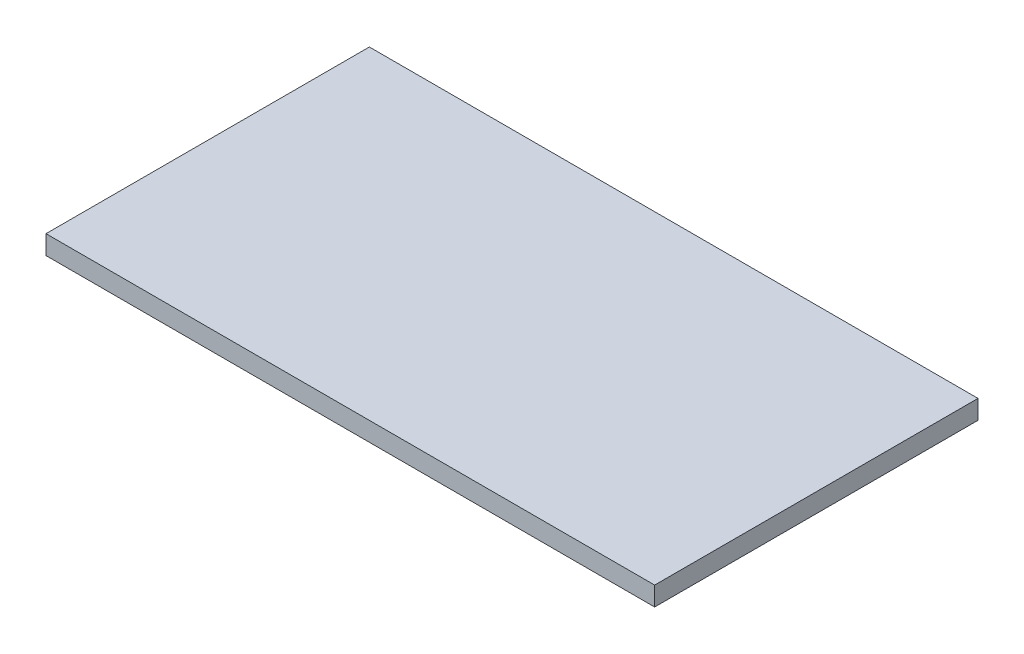
ISO-10303-21;
HEADER;
FILE_DESCRIPTION(('STEP AP214'),'2;1');
FILE_NAME('part.step','',(''),(''),'','','');
FILE_SCHEMA(('AUTOMOTIVE_DESIGN { 1 0 10303 214 1 1 1 1 }'));
ENDSEC;
DATA;
#1=APPLICATION_CONTEXT('core data for automotive mechanical design processes');
#2=APPLICATION_PROTOCOL_DEFINITION('international standard','automotive_design',2000,#1);
#3=PRODUCT_CONTEXT('',#1,'mechanical');
#4=PRODUCT('Part','Part','',(#3));
#5=PRODUCT_RELATED_PRODUCT_CATEGORY('part','',(#4));
#6=PRODUCT_DEFINITION_FORMATION('','',#4);
#7=PRODUCT_DEFINITION_CONTEXT('part definition',#1,'design');
#8=PRODUCT_DEFINITION('design','',#6,#7);
#9=PRODUCT_DEFINITION_SHAPE('','',#8);
#10=(LENGTH_UNIT() NAMED_UNIT(*) SI_UNIT(.MILLI.,.METRE.));
#11=(NAMED_UNIT(*) PLANE_ANGLE_UNIT() SI_UNIT($,.RADIAN.));
#12=(NAMED_UNIT(*) SI_UNIT($,.STERADIAN.) SOLID_ANGLE_UNIT());
#13=UNCERTAINTY_MEASURE_WITH_UNIT(LENGTH_MEASURE(1.E-05),#10,'distance_accuracy_value','');
#14=(GEOMETRIC_REPRESENTATION_CONTEXT(3) GLOBAL_UNCERTAINTY_ASSIGNED_CONTEXT((#13)) GLOBAL_UNIT_ASSIGNED_CONTEXT((#10,
#11,#12)) REPRESENTATION_CONTEXT('',''));
#15=CARTESIAN_POINT('',(0.,0.,0.));
#16=DIRECTION('',(0.,0.,1.));
#17=DIRECTION('',(1.,0.,0.));
#18=AXIS2_PLACEMENT_3D('',#15,#16,#17);
#19=CARTESIAN_POINT('',(160.,10.,-85.));
#20=DIRECTION('',(-1.,0.,0.));
#21=DIRECTION('',(0.,0.,1.));
#22=AXIS2_PLACEMENT_3D('',#19,#20,#21);
#23=PLANE('',#22);
#24=DIRECTION('',(0.,0.,-1.));
#25=VECTOR('',#24,1.);
#26=CARTESIAN_POINT('',(160.,0.,-85.));
#27=LINE('',#26,#25);
#28=CARTESIAN_POINT('',(160.,0.,85.));
#29=VERTEX_POINT('',#28);
#30=CARTESIAN_POINT('',(160.,0.,-85.));
#31=VERTEX_POINT('',#30);
#32=EDGE_CURVE('E96',#29,#31,#27,.T.);
#33=ORIENTED_EDGE('',*,*,#32,.T.);
#34=DIRECTION('',(0.,-1.,0.));
#35=VECTOR('',#34,1.);
#36=CARTESIAN_POINT('',(160.,10.,-85.));
#37=LINE('',#36,#35);
#38=CARTESIAN_POINT('',(160.,10.,-85.));
#39=VERTEX_POINT('',#38);
#40=EDGE_CURVE('E11',#39,#31,#37,.T.);
#41=ORIENTED_EDGE('',*,*,#40,.F.);
#42=DIRECTION('',(0.,0.,-1.));
#43=VECTOR('',#42,1.);
#44=CARTESIAN_POINT('',(160.,10.,-85.));
#45=LINE('',#44,#43);
#46=CARTESIAN_POINT('',(160.,10.,85.));
#47=VERTEX_POINT('',#46);
#48=EDGE_CURVE('E84',#47,#39,#45,.T.);
#49=ORIENTED_EDGE('',*,*,#48,.F.);
#50=DIRECTION('',(0.,-1.,0.));
#51=VECTOR('',#50,1.);
#52=CARTESIAN_POINT('',(160.,10.,85.));
#53=LINE('',#52,#51);
#54=EDGE_CURVE('E92',#47,#29,#53,.T.);
#55=ORIENTED_EDGE('',*,*,#54,.T.);
#56=EDGE_LOOP('',(#33,#41,#49,#55));
#57=FACE_BOUND('',#56,.T.);
#58=ADVANCED_FACE('F33',(#57),#23,.F.);
#59=CARTESIAN_POINT('',(-160.,10.,-85.));
#60=DIRECTION('',(0.,0.,1.));
#61=DIRECTION('',(1.,0.,0.));
#62=AXIS2_PLACEMENT_3D('',#59,#60,#61);
#63=PLANE('',#62);
#64=DIRECTION('',(-1.,0.,0.));
#65=VECTOR('',#64,1.);
#66=CARTESIAN_POINT('',(-160.,0.,-85.));
#67=LINE('',#66,#65);
#68=CARTESIAN_POINT('',(-160.,0.,-85.));
#69=VERTEX_POINT('',#68);
#70=EDGE_CURVE('E88',#31,#69,#67,.T.);
#71=ORIENTED_EDGE('',*,*,#70,.T.);
#72=DIRECTION('',(0.,-1.,0.));
#73=VECTOR('',#72,1.);
#74=CARTESIAN_POINT('',(-160.,10.,-85.));
#75=LINE('',#74,#73);
#76=CARTESIAN_POINT('',(-160.,10.,-85.));
#77=VERTEX_POINT('',#76);
#78=EDGE_CURVE('E41',#77,#69,#75,.T.);
#79=ORIENTED_EDGE('',*,*,#78,.F.);
#80=DIRECTION('',(-1.,0.,0.));
#81=VECTOR('',#80,1.);
#82=CARTESIAN_POINT('',(-160.,10.,-85.));
#83=LINE('',#82,#81);
#84=EDGE_CURVE('E79',#39,#77,#83,.T.);
#85=ORIENTED_EDGE('',*,*,#84,.F.);
#86=ORIENTED_EDGE('',*,*,#40,.T.);
#87=EDGE_LOOP('',(#71,#79,#85,#86));
#88=FACE_BOUND('',#87,.T.);
#89=ADVANCED_FACE('F87',(#88),#63,.F.);
#90=CARTESIAN_POINT('',(-160.,10.,-85.));
#91=DIRECTION('',(1.,0.,0.));
#92=DIRECTION('',(0.,0.,-1.));
#93=AXIS2_PLACEMENT_3D('',#90,#91,#92);
#94=PLANE('',#93);
#95=DIRECTION('',(0.,0.,1.));
#96=VECTOR('',#95,1.);
#97=CARTESIAN_POINT('',(-160.,0.,-85.));
#98=LINE('',#97,#96);
#99=CARTESIAN_POINT('',(-160.,0.,85.));
#100=VERTEX_POINT('',#99);
#101=EDGE_CURVE('E66',#69,#100,#98,.T.);
#102=ORIENTED_EDGE('',*,*,#101,.T.);
#103=DIRECTION('',(0.,-1.,0.));
#104=VECTOR('',#103,1.);
#105=CARTESIAN_POINT('',(-160.,10.,85.));
#106=LINE('',#105,#104);
#107=CARTESIAN_POINT('',(-160.,10.,85.));
#108=VERTEX_POINT('',#107);
#109=EDGE_CURVE('E89',#108,#100,#106,.T.);
#110=ORIENTED_EDGE('',*,*,#109,.F.);
#111=DIRECTION('',(0.,0.,1.));
#112=VECTOR('',#111,1.);
#113=CARTESIAN_POINT('',(-160.,10.,-85.));
#114=LINE('',#113,#112);
#115=EDGE_CURVE('E82',#77,#108,#114,.T.);
#116=ORIENTED_EDGE('',*,*,#115,.F.);
#117=ORIENTED_EDGE('',*,*,#78,.T.);
#118=EDGE_LOOP('',(#102,#110,#116,#117));
#119=FACE_BOUND('',#118,.T.);
#120=ADVANCED_FACE('F90',(#119),#94,.F.);
#121=CARTESIAN_POINT('',(-160.,10.,85.));
#122=DIRECTION('',(0.,0.,-1.));
#123=DIRECTION('',(-1.,0.,0.));
#124=AXIS2_PLACEMENT_3D('',#121,#122,#123);
#125=PLANE('',#124);
#126=DIRECTION('',(1.,0.,0.));
#127=VECTOR('',#126,1.);
#128=CARTESIAN_POINT('',(-160.,0.,85.));
#129=LINE('',#128,#127);
#130=EDGE_CURVE('E72',#100,#29,#129,.T.);
#131=ORIENTED_EDGE('',*,*,#130,.T.);
#132=ORIENTED_EDGE('',*,*,#54,.F.);
#133=DIRECTION('',(1.,0.,0.));
#134=VECTOR('',#133,1.);
#135=CARTESIAN_POINT('',(-160.,10.,85.));
#136=LINE('',#135,#134);
#137=EDGE_CURVE('E49',#108,#47,#136,.T.);
#138=ORIENTED_EDGE('',*,*,#137,.F.);
#139=ORIENTED_EDGE('',*,*,#109,.T.);
#140=EDGE_LOOP('',(#131,#132,#138,#139));
#141=FACE_BOUND('',#140,.T.);
#142=ADVANCED_FACE('F103',(#141),#125,.F.);
#143=CARTESIAN_POINT('',(0.,10.,0.));
#144=DIRECTION('',(0.,1.,0.));
#145=DIRECTION('',(0.,0.,1.));
#146=AXIS2_PLACEMENT_3D('',#143,#144,#145);
#147=PLANE('',#146);
#148=ORIENTED_EDGE('',*,*,#48,.T.);
#149=ORIENTED_EDGE('',*,*,#84,.T.);
#150=ORIENTED_EDGE('',*,*,#115,.T.);
#151=ORIENTED_EDGE('',*,*,#137,.T.);
#152=EDGE_LOOP('',(#148,#149,#150,#151));
#153=FACE_BOUND('',#152,.T.);
#154=ADVANCED_FACE('F80',(#153),#147,.T.);
#155=CARTESIAN_POINT('',(0.,0.,0.));
#156=DIRECTION('',(0.,1.,0.));
#157=DIRECTION('',(0.,0.,1.));
#158=AXIS2_PLACEMENT_3D('',#155,#156,#157);
#159=PLANE('',#158);
#160=ORIENTED_EDGE('',*,*,#32,.F.);
#161=ORIENTED_EDGE('',*,*,#130,.F.);
#162=ORIENTED_EDGE('',*,*,#101,.F.);
#163=ORIENTED_EDGE('',*,*,#70,.F.);
#164=EDGE_LOOP('',(#160,#161,#162,#163));
#165=FACE_BOUND('',#164,.T.);
#166=ADVANCED_FACE('F106',(#165),#159,.F.);
#167=CLOSED_SHELL('',(#58,#89,#120,#142,#154,#166));
#168=MANIFOLD_SOLID_BREP('B2',#167);
#169=ADVANCED_BREP_SHAPE_REPRESENTATION('',(#18,#168),#14);
#170=SHAPE_DEFINITION_REPRESENTATION(#9,#169);
ENDSEC;
END-ISO-10303-21;
